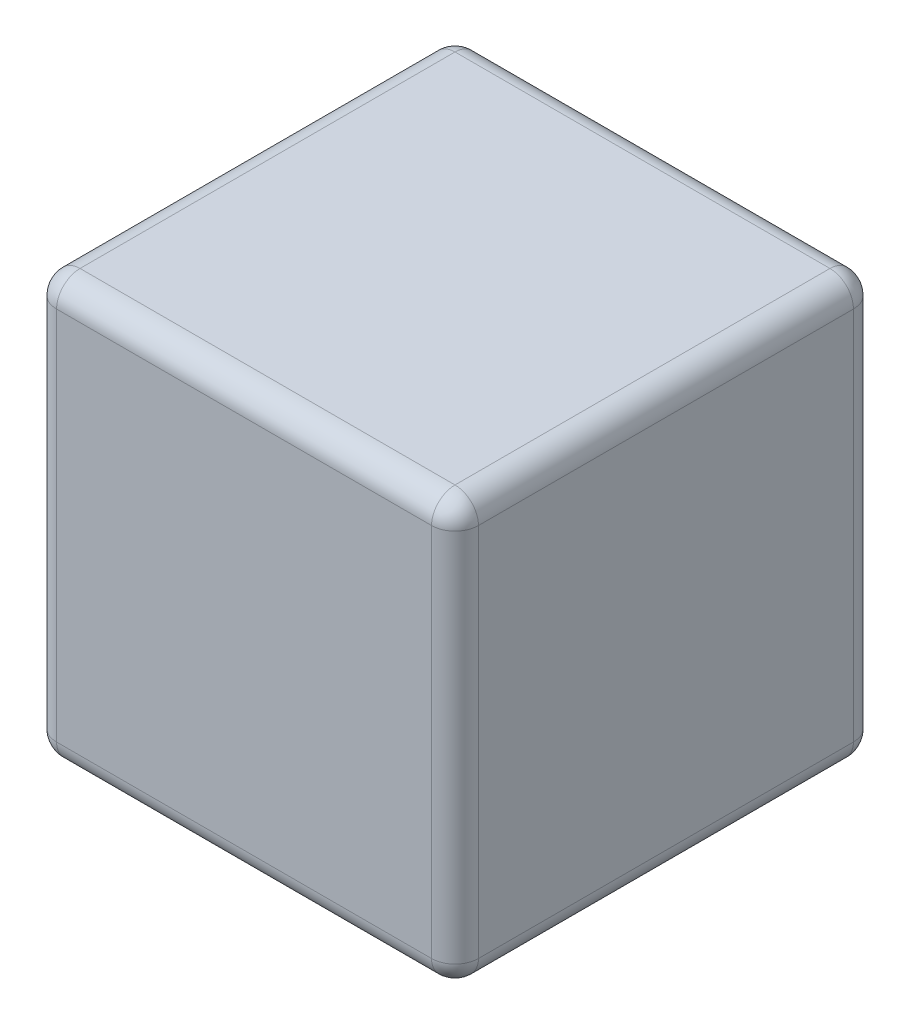
ISO-10303-21;
HEADER;
FILE_DESCRIPTION(('STEP AP214'),'2;1');
FILE_NAME('part.step','',(''),(''),'','','');
FILE_SCHEMA(('AUTOMOTIVE_DESIGN { 1 0 10303 214 1 1 1 1 }'));
ENDSEC;
DATA;
#1=APPLICATION_CONTEXT('core data for automotive mechanical design processes');
#2=APPLICATION_PROTOCOL_DEFINITION('international standard','automotive_design',2000,#1);
#3=PRODUCT_CONTEXT('',#1,'mechanical');
#4=PRODUCT('Part','Part','',(#3));
#5=PRODUCT_RELATED_PRODUCT_CATEGORY('part','',(#4));
#6=PRODUCT_DEFINITION_FORMATION('','',#4);
#7=PRODUCT_DEFINITION_CONTEXT('part definition',#1,'design');
#8=PRODUCT_DEFINITION('design','',#6,#7);
#9=PRODUCT_DEFINITION_SHAPE('','',#8);
#10=(LENGTH_UNIT() NAMED_UNIT(*) SI_UNIT(.MILLI.,.METRE.));
#11=(NAMED_UNIT(*) PLANE_ANGLE_UNIT() SI_UNIT($,.RADIAN.));
#12=(NAMED_UNIT(*) SI_UNIT($,.STERADIAN.) SOLID_ANGLE_UNIT());
#13=UNCERTAINTY_MEASURE_WITH_UNIT(LENGTH_MEASURE(1.E-05),#10,'distance_accuracy_value','');
#14=(GEOMETRIC_REPRESENTATION_CONTEXT(3) GLOBAL_UNCERTAINTY_ASSIGNED_CONTEXT((#13)) GLOBAL_UNIT_ASSIGNED_CONTEXT((#10,
#11,#12)) REPRESENTATION_CONTEXT('',''));
#15=CARTESIAN_POINT('',(0.,0.,0.));
#16=DIRECTION('',(0.,0.,1.));
#17=DIRECTION('',(1.,0.,0.));
#18=AXIS2_PLACEMENT_3D('',#15,#16,#17);
#19=CARTESIAN_POINT('',(0.,18.,0.));
#20=DIRECTION('',(1.,0.,0.));
#21=DIRECTION('',(0.,0.,-1.));
#22=AXIS2_PLACEMENT_3D('',#19,#20,#21);
#23=PLANE('',#22);
#24=DIRECTION('',(0.,0.,1.));
#25=VECTOR('',#24,1.);
#26=CARTESIAN_POINT('',(0.,17.,0.));
#27=LINE('',#26,#25);
#28=CARTESIAN_POINT('',(0.,17.,-1.));
#29=VERTEX_POINT('',#28);
#30=CARTESIAN_POINT('',(0.,17.,-17.));
#31=VERTEX_POINT('',#30);
#32=EDGE_CURVE('E193',#29,#31,#27,.F.);
#33=ORIENTED_EDGE('',*,*,#32,.T.);
#34=DIRECTION('',(0.,-1.,0.));
#35=VECTOR('',#34,1.);
#36=CARTESIAN_POINT('',(0.,18.,-17.));
#37=LINE('',#36,#35);
#38=CARTESIAN_POINT('',(0.,1.,-17.));
#39=VERTEX_POINT('',#38);
#40=EDGE_CURVE('E195',#31,#39,#37,.T.);
#41=ORIENTED_EDGE('',*,*,#40,.T.);
#42=DIRECTION('',(0.,0.,1.));
#43=VECTOR('',#42,1.);
#44=CARTESIAN_POINT('',(0.,1.,0.));
#45=LINE('',#44,#43);
#46=CARTESIAN_POINT('',(0.,1.,-1.));
#47=VERTEX_POINT('',#46);
#48=EDGE_CURVE('E191',#39,#47,#45,.T.);
#49=ORIENTED_EDGE('',*,*,#48,.T.);
#50=DIRECTION('',(0.,-1.,0.));
#51=VECTOR('',#50,1.);
#52=CARTESIAN_POINT('',(0.,18.,-1.));
#53=LINE('',#52,#51);
#54=EDGE_CURVE('E189',#47,#29,#53,.F.);
#55=ORIENTED_EDGE('',*,*,#54,.T.);
#56=EDGE_LOOP('',(#33,#41,#49,#55));
#57=FACE_BOUND('',#56,.T.);
#58=ADVANCED_FACE('F37',(#57),#23,.F.);
#59=CARTESIAN_POINT('',(0.,18.,0.));
#60=DIRECTION('',(0.,0.,-1.));
#61=DIRECTION('',(-1.,0.,0.));
#62=AXIS2_PLACEMENT_3D('',#59,#60,#61);
#63=PLANE('',#62);
#64=DIRECTION('',(1.,0.,0.));
#65=VECTOR('',#64,1.);
#66=CARTESIAN_POINT('',(0.,17.,0.));
#67=LINE('',#66,#65);
#68=CARTESIAN_POINT('',(17.,17.,0.));
#69=VERTEX_POINT('',#68);
#70=CARTESIAN_POINT('',(1.,17.,0.));
#71=VERTEX_POINT('',#70);
#72=EDGE_CURVE('E46',#69,#71,#67,.F.);
#73=ORIENTED_EDGE('',*,*,#72,.T.);
#74=DIRECTION('',(0.,-1.,0.));
#75=VECTOR('',#74,1.);
#76=CARTESIAN_POINT('',(1.,18.,0.));
#77=LINE('',#76,#75);
#78=CARTESIAN_POINT('',(1.,1.,0.));
#79=VERTEX_POINT('',#78);
#80=EDGE_CURVE('E11',#71,#79,#77,.T.);
#81=ORIENTED_EDGE('',*,*,#80,.T.);
#82=DIRECTION('',(1.,0.,0.));
#83=VECTOR('',#82,1.);
#84=CARTESIAN_POINT('',(18.,1.,0.));
#85=LINE('',#84,#83);
#86=CARTESIAN_POINT('',(17.,1.,0.));
#87=VERTEX_POINT('',#86);
#88=EDGE_CURVE('E198',#79,#87,#85,.T.);
#89=ORIENTED_EDGE('',*,*,#88,.T.);
#90=DIRECTION('',(0.,-1.,0.));
#91=VECTOR('',#90,1.);
#92=CARTESIAN_POINT('',(17.,18.,0.));
#93=LINE('',#92,#91);
#94=EDGE_CURVE('E57',#87,#69,#93,.F.);
#95=ORIENTED_EDGE('',*,*,#94,.T.);
#96=EDGE_LOOP('',(#73,#81,#89,#95));
#97=FACE_BOUND('',#96,.T.);
#98=ADVANCED_FACE('F300',(#97),#63,.F.);
#99=CARTESIAN_POINT('',(18.,18.,0.));
#100=DIRECTION('',(-1.,0.,0.));
#101=DIRECTION('',(0.,0.,1.));
#102=AXIS2_PLACEMENT_3D('',#99,#100,#101);
#103=PLANE('',#102);
#104=DIRECTION('',(0.,0.,-1.));
#105=VECTOR('',#104,1.);
#106=CARTESIAN_POINT('',(18.,1.,-18.));
#107=LINE('',#106,#105);
#108=CARTESIAN_POINT('',(18.,1.,-1.));
#109=VERTEX_POINT('',#108);
#110=CARTESIAN_POINT('',(18.,1.,-17.));
#111=VERTEX_POINT('',#110);
#112=EDGE_CURVE('E175',#109,#111,#107,.T.);
#113=ORIENTED_EDGE('',*,*,#112,.T.);
#114=DIRECTION('',(0.,-1.,0.));
#115=VECTOR('',#114,1.);
#116=CARTESIAN_POINT('',(18.,18.,-17.));
#117=LINE('',#116,#115);
#118=CARTESIAN_POINT('',(18.,17.,-17.));
#119=VERTEX_POINT('',#118);
#120=EDGE_CURVE('E177',#111,#119,#117,.F.);
#121=ORIENTED_EDGE('',*,*,#120,.T.);
#122=DIRECTION('',(0.,0.,-1.));
#123=VECTOR('',#122,1.);
#124=CARTESIAN_POINT('',(18.,17.,0.));
#125=LINE('',#124,#123);
#126=CARTESIAN_POINT('',(18.,17.,-1.));
#127=VERTEX_POINT('',#126);
#128=EDGE_CURVE('E173',#119,#127,#125,.F.);
#129=ORIENTED_EDGE('',*,*,#128,.T.);
#130=DIRECTION('',(0.,-1.,0.));
#131=VECTOR('',#130,1.);
#132=CARTESIAN_POINT('',(18.,18.,-1.));
#133=LINE('',#132,#131);
#134=EDGE_CURVE('E171',#127,#109,#133,.T.);
#135=ORIENTED_EDGE('',*,*,#134,.T.);
#136=EDGE_LOOP('',(#113,#121,#129,#135));
#137=FACE_BOUND('',#136,.T.);
#138=ADVANCED_FACE('F272',(#137),#103,.F.);
#139=CARTESIAN_POINT('',(0.,18.,-18.));
#140=DIRECTION('',(0.,0.,1.));
#141=DIRECTION('',(1.,0.,0.));
#142=AXIS2_PLACEMENT_3D('',#139,#140,#141);
#143=PLANE('',#142);
#144=DIRECTION('',(0.,-1.,0.));
#145=VECTOR('',#144,1.);
#146=CARTESIAN_POINT('',(17.,18.,-18.));
#147=LINE('',#146,#145);
#148=CARTESIAN_POINT('',(17.,17.,-18.));
#149=VERTEX_POINT('',#148);
#150=CARTESIAN_POINT('',(17.,1.,-18.));
#151=VERTEX_POINT('',#150);
#152=EDGE_CURVE('E158',#149,#151,#147,.T.);
#153=ORIENTED_EDGE('',*,*,#152,.T.);
#154=DIRECTION('',(-1.,0.,0.));
#155=VECTOR('',#154,1.);
#156=CARTESIAN_POINT('',(0.,1.,-18.));
#157=LINE('',#156,#155);
#158=CARTESIAN_POINT('',(0.999999999999997,1.,-18.));
#159=VERTEX_POINT('',#158);
#160=EDGE_CURVE('E130',#151,#159,#157,.T.);
#161=ORIENTED_EDGE('',*,*,#160,.T.);
#162=DIRECTION('',(0.,-1.,0.));
#163=VECTOR('',#162,1.);
#164=CARTESIAN_POINT('',(0.999999999999997,18.,-18.));
#165=LINE('',#164,#163);
#166=CARTESIAN_POINT('',(0.999999999999997,17.,-18.));
#167=VERTEX_POINT('',#166);
#168=EDGE_CURVE('E148',#159,#167,#165,.F.);
#169=ORIENTED_EDGE('',*,*,#168,.T.);
#170=DIRECTION('',(-1.,0.,0.));
#171=VECTOR('',#170,1.);
#172=CARTESIAN_POINT('',(0.,17.,-18.));
#173=LINE('',#172,#171);
#174=EDGE_CURVE('E154',#167,#149,#173,.F.);
#175=ORIENTED_EDGE('',*,*,#174,.T.);
#176=EDGE_LOOP('',(#153,#161,#169,#175));
#177=FACE_BOUND('',#176,.T.);
#178=ADVANCED_FACE('F156',(#177),#143,.F.);
#179=CARTESIAN_POINT('',(0.,18.,0.));
#180=DIRECTION('',(0.,-1.,0.));
#181=DIRECTION('',(0.,0.,-1.));
#182=AXIS2_PLACEMENT_3D('',#179,#180,#181);
#183=PLANE('',#182);
#184=DIRECTION('',(0.,0.,-1.));
#185=VECTOR('',#184,1.);
#186=CARTESIAN_POINT('',(17.,18.,0.));
#187=LINE('',#186,#185);
#188=CARTESIAN_POINT('',(17.,18.,-1.));
#189=VERTEX_POINT('',#188);
#190=CARTESIAN_POINT('',(17.,18.,-17.));
#191=VERTEX_POINT('',#190);
#192=EDGE_CURVE('E184',#189,#191,#187,.T.);
#193=ORIENTED_EDGE('',*,*,#192,.T.);
#194=DIRECTION('',(-1.,0.,0.));
#195=VECTOR('',#194,1.);
#196=CARTESIAN_POINT('',(0.,18.,-17.));
#197=LINE('',#196,#195);
#198=CARTESIAN_POINT('',(0.999999999999997,18.,-17.));
#199=VERTEX_POINT('',#198);
#200=EDGE_CURVE('E186',#191,#199,#197,.T.);
#201=ORIENTED_EDGE('',*,*,#200,.T.);
#202=DIRECTION('',(0.,0.,1.));
#203=VECTOR('',#202,1.);
#204=CARTESIAN_POINT('',(1.,18.,0.));
#205=LINE('',#204,#203);
#206=CARTESIAN_POINT('',(1.,18.,-1.));
#207=VERTEX_POINT('',#206);
#208=EDGE_CURVE('E182',#199,#207,#205,.T.);
#209=ORIENTED_EDGE('',*,*,#208,.T.);
#210=DIRECTION('',(1.,0.,0.));
#211=VECTOR('',#210,1.);
#212=CARTESIAN_POINT('',(0.,18.,-1.));
#213=LINE('',#212,#211);
#214=EDGE_CURVE('E180',#207,#189,#213,.T.);
#215=ORIENTED_EDGE('',*,*,#214,.T.);
#216=EDGE_LOOP('',(#193,#201,#209,#215));
#217=FACE_BOUND('',#216,.T.);
#218=ADVANCED_FACE('F281',(#217),#183,.F.);
#219=CARTESIAN_POINT('',(0.,0.,0.));
#220=DIRECTION('',(0.,-1.,0.));
#221=DIRECTION('',(0.,0.,-1.));
#222=AXIS2_PLACEMENT_3D('',#219,#220,#221);
#223=PLANE('',#222);
#224=DIRECTION('',(0.,0.,1.));
#225=VECTOR('',#224,1.);
#226=CARTESIAN_POINT('',(0.999999999999997,0.,-18.));
#227=LINE('',#226,#225);
#228=CARTESIAN_POINT('',(1.,0.,-1.));
#229=VERTEX_POINT('',#228);
#230=CARTESIAN_POINT('',(0.999999999999997,0.,-17.));
#231=VERTEX_POINT('',#230);
#232=EDGE_CURVE('E162',#229,#231,#227,.F.);
#233=ORIENTED_EDGE('',*,*,#232,.T.);
#234=DIRECTION('',(-1.,0.,0.));
#235=VECTOR('',#234,1.);
#236=CARTESIAN_POINT('',(18.,0.,-17.));
#237=LINE('',#236,#235);
#238=CARTESIAN_POINT('',(17.,0.,-17.));
#239=VERTEX_POINT('',#238);
#240=EDGE_CURVE('E132',#231,#239,#237,.F.);
#241=ORIENTED_EDGE('',*,*,#240,.T.);
#242=DIRECTION('',(0.,0.,-1.));
#243=VECTOR('',#242,1.);
#244=CARTESIAN_POINT('',(17.,0.,0.));
#245=LINE('',#244,#243);
#246=CARTESIAN_POINT('',(17.,0.,-1.));
#247=VERTEX_POINT('',#246);
#248=EDGE_CURVE('E168',#239,#247,#245,.F.);
#249=ORIENTED_EDGE('',*,*,#248,.T.);
#250=DIRECTION('',(1.,0.,0.));
#251=VECTOR('',#250,1.);
#252=CARTESIAN_POINT('',(0.,0.,-1.));
#253=LINE('',#252,#251);
#254=EDGE_CURVE('E160',#247,#229,#253,.F.);
#255=ORIENTED_EDGE('',*,*,#254,.T.);
#256=EDGE_LOOP('',(#233,#241,#249,#255));
#257=FACE_BOUND('',#256,.T.);
#258=ADVANCED_FACE('F360',(#257),#223,.T.);
#259=CARTESIAN_POINT('',(0.,17.,-1.));
#260=DIRECTION('',(1.,0.,0.));
#261=DIRECTION('',(0.,0.,-1.));
#262=AXIS2_PLACEMENT_3D('',#259,#260,#261);
#263=CYLINDRICAL_SURFACE('',#262,1.);
#264=CARTESIAN_POINT('',(17.,17.,-1.));
#265=DIRECTION('',(1.,0.,0.));
#266=DIRECTION('',(0.,0.,-1.));
#267=AXIS2_PLACEMENT_3D('',#264,#265,#266);
#268=CIRCLE('',#267,1.);
#269=EDGE_CURVE('E41',#189,#69,#268,.T.);
#270=ORIENTED_EDGE('',*,*,#269,.F.);
#271=ORIENTED_EDGE('',*,*,#214,.F.);
#272=CARTESIAN_POINT('',(1.,17.,-1.));
#273=DIRECTION('',(-1.,0.,0.));
#274=DIRECTION('',(0.,0.,1.));
#275=AXIS2_PLACEMENT_3D('',#272,#273,#274);
#276=CIRCLE('',#275,1.);
#277=EDGE_CURVE('E251',#71,#207,#276,.T.);
#278=ORIENTED_EDGE('',*,*,#277,.F.);
#279=ORIENTED_EDGE('',*,*,#72,.F.);
#280=EDGE_LOOP('',(#270,#271,#278,#279));
#281=FACE_BOUND('',#280,.T.);
#282=ADVANCED_FACE('F39',(#281),#263,.T.);
#283=CARTESIAN_POINT('',(17.,17.,-1.));
#284=DIRECTION('',(0.,0.,1.));
#285=DIRECTION('',(1.,0.,0.));
#286=AXIS2_PLACEMENT_3D('',#283,#284,#285);
#287=SPHERICAL_SURFACE('',#286,1.);
#288=CARTESIAN_POINT('',(17.,17.,-1.));
#289=DIRECTION('',(0.,0.,1.));
#290=DIRECTION('',(1.,0.,0.));
#291=AXIS2_PLACEMENT_3D('',#288,#289,#290);
#292=CIRCLE('',#291,1.);
#293=EDGE_CURVE('E246',#189,#127,#292,.F.);
#294=ORIENTED_EDGE('',*,*,#293,.F.);
#295=ORIENTED_EDGE('',*,*,#269,.T.);
#296=CARTESIAN_POINT('',(17.,17.,-1.));
#297=DIRECTION('',(0.,1.,0.));
#298=DIRECTION('',(0.,0.,1.));
#299=AXIS2_PLACEMENT_3D('',#296,#297,#298);
#300=CIRCLE('',#299,1.);
#301=EDGE_CURVE('E249',#127,#69,#300,.F.);
#302=ORIENTED_EDGE('',*,*,#301,.F.);
#303=EDGE_LOOP('',(#294,#295,#302));
#304=FACE_BOUND('',#303,.T.);
#305=ADVANCED_FACE('F261',(#304),#287,.T.);
#306=CARTESIAN_POINT('',(1.,17.,-1.));
#307=DIRECTION('',(0.,1.,0.));
#308=DIRECTION('',(0.,0.,1.));
#309=AXIS2_PLACEMENT_3D('',#306,#307,#308);
#310=SPHERICAL_SURFACE('',#309,1.);
#311=CARTESIAN_POINT('',(1.,17.,-1.));
#312=DIRECTION('',(0.,1.,0.));
#313=DIRECTION('',(0.,0.,1.));
#314=AXIS2_PLACEMENT_3D('',#311,#312,#313);
#315=CIRCLE('',#314,1.);
#316=EDGE_CURVE('E240',#71,#29,#315,.F.);
#317=ORIENTED_EDGE('',*,*,#316,.F.);
#318=ORIENTED_EDGE('',*,*,#277,.T.);
#319=CARTESIAN_POINT('',(1.,17.,-1.));
#320=DIRECTION('',(0.,0.,1.));
#321=DIRECTION('',(1.,0.,0.));
#322=AXIS2_PLACEMENT_3D('',#319,#320,#321);
#323=CIRCLE('',#322,1.);
#324=EDGE_CURVE('E243',#29,#207,#323,.F.);
#325=ORIENTED_EDGE('',*,*,#324,.F.);
#326=EDGE_LOOP('',(#317,#318,#325));
#327=FACE_BOUND('',#326,.T.);
#328=ADVANCED_FACE('F294',(#327),#310,.T.);
#329=CARTESIAN_POINT('',(17.,18.,-1.));
#330=DIRECTION('',(0.,-1.,0.));
#331=DIRECTION('',(0.,0.,-1.));
#332=AXIS2_PLACEMENT_3D('',#329,#330,#331);
#333=CYLINDRICAL_SURFACE('',#332,1.);
#334=ORIENTED_EDGE('',*,*,#301,.T.);
#335=ORIENTED_EDGE('',*,*,#94,.F.);
#336=CARTESIAN_POINT('',(17.,1.,-1.));
#337=DIRECTION('',(0.,-1.,0.));
#338=DIRECTION('',(0.,0.,-1.));
#339=AXIS2_PLACEMENT_3D('',#336,#337,#338);
#340=CIRCLE('',#339,1.);
#341=EDGE_CURVE('E234',#109,#87,#340,.T.);
#342=ORIENTED_EDGE('',*,*,#341,.F.);
#343=ORIENTED_EDGE('',*,*,#134,.F.);
#344=EDGE_LOOP('',(#334,#335,#342,#343));
#345=FACE_BOUND('',#344,.T.);
#346=ADVANCED_FACE('F267',(#345),#333,.T.);
#347=CARTESIAN_POINT('',(17.,17.,0.));
#348=DIRECTION('',(0.,0.,-1.));
#349=DIRECTION('',(-1.,0.,0.));
#350=AXIS2_PLACEMENT_3D('',#347,#348,#349);
#351=CYLINDRICAL_SURFACE('',#350,1.);
#352=ORIENTED_EDGE('',*,*,#293,.T.);
#353=ORIENTED_EDGE('',*,*,#128,.F.);
#354=CARTESIAN_POINT('',(17.,17.,-17.));
#355=DIRECTION('',(0.,0.,-1.));
#356=DIRECTION('',(-1.,0.,0.));
#357=AXIS2_PLACEMENT_3D('',#354,#355,#356);
#358=CIRCLE('',#357,1.);
#359=EDGE_CURVE('E231',#191,#119,#358,.T.);
#360=ORIENTED_EDGE('',*,*,#359,.F.);
#361=ORIENTED_EDGE('',*,*,#192,.F.);
#362=EDGE_LOOP('',(#352,#353,#360,#361));
#363=FACE_BOUND('',#362,.T.);
#364=ADVANCED_FACE('F278',(#363),#351,.T.);
#365=CARTESIAN_POINT('',(0.,17.,-17.));
#366=DIRECTION('',(-1.,0.,0.));
#367=DIRECTION('',(0.,0.,1.));
#368=AXIS2_PLACEMENT_3D('',#365,#366,#367);
#369=CYLINDRICAL_SURFACE('',#368,1.);
#370=CARTESIAN_POINT('',(0.999999999999997,17.,-17.));
#371=DIRECTION('',(-1.,0.,0.));
#372=DIRECTION('',(0.,0.,1.));
#373=AXIS2_PLACEMENT_3D('',#370,#371,#372);
#374=CIRCLE('',#373,1.);
#375=EDGE_CURVE('E225',#199,#167,#374,.T.);
#376=ORIENTED_EDGE('',*,*,#375,.F.);
#377=ORIENTED_EDGE('',*,*,#200,.F.);
#378=CARTESIAN_POINT('',(17.,17.,-17.));
#379=DIRECTION('',(1.,0.,0.));
#380=DIRECTION('',(0.,0.,-1.));
#381=AXIS2_PLACEMENT_3D('',#378,#379,#380);
#382=CIRCLE('',#381,1.);
#383=EDGE_CURVE('E228',#149,#191,#382,.T.);
#384=ORIENTED_EDGE('',*,*,#383,.F.);
#385=ORIENTED_EDGE('',*,*,#174,.F.);
#386=EDGE_LOOP('',(#376,#377,#384,#385));
#387=FACE_BOUND('',#386,.T.);
#388=ADVANCED_FACE('F285',(#387),#369,.T.);
#389=CARTESIAN_POINT('',(1.,17.,0.));
#390=DIRECTION('',(0.,0.,1.));
#391=DIRECTION('',(1.,0.,0.));
#392=AXIS2_PLACEMENT_3D('',#389,#390,#391);
#393=CYLINDRICAL_SURFACE('',#392,1.);
#394=ORIENTED_EDGE('',*,*,#324,.T.);
#395=ORIENTED_EDGE('',*,*,#208,.F.);
#396=CARTESIAN_POINT('',(0.999999999999997,17.,-17.));
#397=DIRECTION('',(0.,0.,-1.));
#398=DIRECTION('',(-1.,0.,0.));
#399=AXIS2_PLACEMENT_3D('',#396,#397,#398);
#400=CIRCLE('',#399,1.);
#401=EDGE_CURVE('E223',#31,#199,#400,.T.);
#402=ORIENTED_EDGE('',*,*,#401,.F.);
#403=ORIENTED_EDGE('',*,*,#32,.F.);
#404=EDGE_LOOP('',(#394,#395,#402,#403));
#405=FACE_BOUND('',#404,.T.);
#406=ADVANCED_FACE('F291',(#405),#393,.T.);
#407=CARTESIAN_POINT('',(1.,18.,-1.));
#408=DIRECTION('',(0.,-1.,0.));
#409=DIRECTION('',(0.,0.,-1.));
#410=AXIS2_PLACEMENT_3D('',#407,#408,#409);
#411=CYLINDRICAL_SURFACE('',#410,1.);
#412=ORIENTED_EDGE('',*,*,#316,.T.);
#413=ORIENTED_EDGE('',*,*,#54,.F.);
#414=CARTESIAN_POINT('',(1.,1.,-1.));
#415=DIRECTION('',(0.,-1.,0.));
#416=DIRECTION('',(0.,0.,-1.));
#417=AXIS2_PLACEMENT_3D('',#414,#415,#416);
#418=CIRCLE('',#417,1.);
#419=EDGE_CURVE('E220',#79,#47,#418,.T.);
#420=ORIENTED_EDGE('',*,*,#419,.F.);
#421=ORIENTED_EDGE('',*,*,#80,.F.);
#422=EDGE_LOOP('',(#412,#413,#420,#421));
#423=FACE_BOUND('',#422,.T.);
#424=ADVANCED_FACE('F298',(#423),#411,.T.);
#425=CARTESIAN_POINT('',(0.,1.,-1.));
#426=DIRECTION('',(-1.,0.,0.));
#427=DIRECTION('',(0.,0.,1.));
#428=AXIS2_PLACEMENT_3D('',#425,#426,#427);
#429=CYLINDRICAL_SURFACE('',#428,1.);
#430=CARTESIAN_POINT('',(17.,1.,-1.));
#431=DIRECTION('',(1.,0.,0.));
#432=DIRECTION('',(0.,0.,-1.));
#433=AXIS2_PLACEMENT_3D('',#430,#431,#432);
#434=CIRCLE('',#433,1.);
#435=EDGE_CURVE('E237',#87,#247,#434,.T.);
#436=ORIENTED_EDGE('',*,*,#435,.F.);
#437=ORIENTED_EDGE('',*,*,#88,.F.);
#438=CARTESIAN_POINT('',(1.,1.,-1.));
#439=DIRECTION('',(-1.,0.,0.));
#440=DIRECTION('',(0.,0.,1.));
#441=AXIS2_PLACEMENT_3D('',#438,#439,#440);
#442=CIRCLE('',#441,1.);
#443=EDGE_CURVE('E218',#229,#79,#442,.T.);
#444=ORIENTED_EDGE('',*,*,#443,.F.);
#445=ORIENTED_EDGE('',*,*,#254,.F.);
#446=EDGE_LOOP('',(#436,#437,#444,#445));
#447=FACE_BOUND('',#446,.T.);
#448=ADVANCED_FACE('F303',(#447),#429,.T.);
#449=CARTESIAN_POINT('',(17.,1.,-1.));
#450=DIRECTION('',(0.,0.,1.));
#451=DIRECTION('',(0.,-1.,0.));
#452=AXIS2_PLACEMENT_3D('',#449,#450,#451);
#453=SPHERICAL_SURFACE('',#452,1.);
#454=ORIENTED_EDGE('',*,*,#341,.T.);
#455=ORIENTED_EDGE('',*,*,#435,.T.);
#456=CARTESIAN_POINT('',(17.,1.,-1.));
#457=DIRECTION('',(0.,0.,1.));
#458=DIRECTION('',(1.,0.,0.));
#459=AXIS2_PLACEMENT_3D('',#456,#457,#458);
#460=CIRCLE('',#459,1.);
#461=EDGE_CURVE('E215',#109,#247,#460,.F.);
#462=ORIENTED_EDGE('',*,*,#461,.F.);
#463=EDGE_LOOP('',(#454,#455,#462));
#464=FACE_BOUND('',#463,.T.);
#465=ADVANCED_FACE('F307',(#464),#453,.T.);
#466=CARTESIAN_POINT('',(17.,17.,-17.));
#467=DIRECTION('',(0.,1.,0.));
#468=DIRECTION('',(0.,0.,1.));
#469=AXIS2_PLACEMENT_3D('',#466,#467,#468);
#470=SPHERICAL_SURFACE('',#469,1.);
#471=ORIENTED_EDGE('',*,*,#383,.T.);
#472=ORIENTED_EDGE('',*,*,#359,.T.);
#473=CARTESIAN_POINT('',(17.,17.,-17.));
#474=DIRECTION('',(0.,1.,0.));
#475=DIRECTION('',(0.,0.,1.));
#476=AXIS2_PLACEMENT_3D('',#473,#474,#475);
#477=CIRCLE('',#476,1.);
#478=EDGE_CURVE('E213',#149,#119,#477,.F.);
#479=ORIENTED_EDGE('',*,*,#478,.F.);
#480=EDGE_LOOP('',(#471,#472,#479));
#481=FACE_BOUND('',#480,.T.);
#482=ADVANCED_FACE('F318',(#481),#470,.T.);
#483=CARTESIAN_POINT('',(0.999999999999997,17.,-17.));
#484=DIRECTION('',(0.,1.,0.));
#485=DIRECTION('',(0.,0.,1.));
#486=AXIS2_PLACEMENT_3D('',#483,#484,#485);
#487=SPHERICAL_SURFACE('',#486,1.);
#488=ORIENTED_EDGE('',*,*,#401,.T.);
#489=ORIENTED_EDGE('',*,*,#375,.T.);
#490=CARTESIAN_POINT('',(0.999999999999997,17.,-17.));
#491=DIRECTION('',(0.,1.,0.));
#492=DIRECTION('',(0.,0.,1.));
#493=AXIS2_PLACEMENT_3D('',#490,#491,#492);
#494=CIRCLE('',#493,1.);
#495=EDGE_CURVE('E151',#31,#167,#494,.F.);
#496=ORIENTED_EDGE('',*,*,#495,.F.);
#497=EDGE_LOOP('',(#488,#489,#496));
#498=FACE_BOUND('',#497,.T.);
#499=ADVANCED_FACE('F320',(#498),#487,.T.);
#500=CARTESIAN_POINT('',(1.,1.,-1.));
#501=DIRECTION('',(0.,0.,1.));
#502=DIRECTION('',(0.,-1.,0.));
#503=AXIS2_PLACEMENT_3D('',#500,#501,#502);
#504=SPHERICAL_SURFACE('',#503,1.);
#505=ORIENTED_EDGE('',*,*,#443,.T.);
#506=ORIENTED_EDGE('',*,*,#419,.T.);
#507=CARTESIAN_POINT('',(1.,1.,-1.));
#508=DIRECTION('',(0.,0.,1.));
#509=DIRECTION('',(1.,0.,0.));
#510=AXIS2_PLACEMENT_3D('',#507,#508,#509);
#511=CIRCLE('',#510,1.);
#512=EDGE_CURVE('E209',#229,#47,#511,.F.);
#513=ORIENTED_EDGE('',*,*,#512,.F.);
#514=EDGE_LOOP('',(#505,#506,#513));
#515=FACE_BOUND('',#514,.T.);
#516=ADVANCED_FACE('F326',(#515),#504,.T.);
#517=CARTESIAN_POINT('',(17.,1.,0.));
#518=DIRECTION('',(0.,0.,1.));
#519=DIRECTION('',(1.,0.,0.));
#520=AXIS2_PLACEMENT_3D('',#517,#518,#519);
#521=CYLINDRICAL_SURFACE('',#520,1.);
#522=ORIENTED_EDGE('',*,*,#461,.T.);
#523=ORIENTED_EDGE('',*,*,#248,.F.);
#524=CARTESIAN_POINT('',(17.,1.,-17.));
#525=DIRECTION('',(0.,0.,-1.));
#526=DIRECTION('',(-1.,0.,0.));
#527=AXIS2_PLACEMENT_3D('',#524,#525,#526);
#528=CIRCLE('',#527,1.);
#529=EDGE_CURVE('E206',#111,#239,#528,.T.);
#530=ORIENTED_EDGE('',*,*,#529,.F.);
#531=ORIENTED_EDGE('',*,*,#112,.F.);
#532=EDGE_LOOP('',(#522,#523,#530,#531));
#533=FACE_BOUND('',#532,.T.);
#534=ADVANCED_FACE('F311',(#533),#521,.T.);
#535=CARTESIAN_POINT('',(17.,18.,-17.));
#536=DIRECTION('',(0.,-1.,0.));
#537=DIRECTION('',(0.,0.,-1.));
#538=AXIS2_PLACEMENT_3D('',#535,#536,#537);
#539=CYLINDRICAL_SURFACE('',#538,1.);
#540=ORIENTED_EDGE('',*,*,#478,.T.);
#541=ORIENTED_EDGE('',*,*,#120,.F.);
#542=CARTESIAN_POINT('',(17.,1.,-17.));
#543=DIRECTION('',(0.,-1.,0.));
#544=DIRECTION('',(0.,0.,-1.));
#545=AXIS2_PLACEMENT_3D('',#542,#543,#544);
#546=CIRCLE('',#545,1.);
#547=EDGE_CURVE('E145',#151,#111,#546,.T.);
#548=ORIENTED_EDGE('',*,*,#547,.F.);
#549=ORIENTED_EDGE('',*,*,#152,.F.);
#550=EDGE_LOOP('',(#540,#541,#548,#549));
#551=FACE_BOUND('',#550,.T.);
#552=ADVANCED_FACE('F316',(#551),#539,.T.);
#553=CARTESIAN_POINT('',(0.999999999999997,18.,-17.));
#554=DIRECTION('',(0.,-1.,0.));
#555=DIRECTION('',(0.,0.,-1.));
#556=AXIS2_PLACEMENT_3D('',#553,#554,#555);
#557=CYLINDRICAL_SURFACE('',#556,1.);
#558=ORIENTED_EDGE('',*,*,#495,.T.);
#559=ORIENTED_EDGE('',*,*,#168,.F.);
#560=CARTESIAN_POINT('',(0.999999999999997,1.,-17.));
#561=DIRECTION('',(0.,-1.,0.));
#562=DIRECTION('',(0.,0.,-1.));
#563=AXIS2_PLACEMENT_3D('',#560,#561,#562);
#564=CIRCLE('',#563,1.);
#565=EDGE_CURVE('E137',#39,#159,#564,.T.);
#566=ORIENTED_EDGE('',*,*,#565,.F.);
#567=ORIENTED_EDGE('',*,*,#40,.F.);
#568=EDGE_LOOP('',(#558,#559,#566,#567));
#569=FACE_BOUND('',#568,.T.);
#570=ADVANCED_FACE('F149',(#569),#557,.T.);
#571=CARTESIAN_POINT('',(1.,1.,0.));
#572=DIRECTION('',(0.,0.,-1.));
#573=DIRECTION('',(-1.,0.,0.));
#574=AXIS2_PLACEMENT_3D('',#571,#572,#573);
#575=CYLINDRICAL_SURFACE('',#574,1.);
#576=ORIENTED_EDGE('',*,*,#512,.T.);
#577=ORIENTED_EDGE('',*,*,#48,.F.);
#578=CARTESIAN_POINT('',(0.999999999999997,1.,-17.));
#579=DIRECTION('',(0.,0.,-1.));
#580=DIRECTION('',(-1.,0.,0.));
#581=AXIS2_PLACEMENT_3D('',#578,#579,#580);
#582=CIRCLE('',#581,1.);
#583=EDGE_CURVE('E141',#231,#39,#582,.T.);
#584=ORIENTED_EDGE('',*,*,#583,.F.);
#585=ORIENTED_EDGE('',*,*,#232,.F.);
#586=EDGE_LOOP('',(#576,#577,#584,#585));
#587=FACE_BOUND('',#586,.T.);
#588=ADVANCED_FACE('F344',(#587),#575,.T.);
#589=CARTESIAN_POINT('',(17.,1.,-17.));
#590=DIRECTION('',(1.,0.,0.));
#591=DIRECTION('',(0.,1.,0.));
#592=AXIS2_PLACEMENT_3D('',#589,#590,#591);
#593=SPHERICAL_SURFACE('',#592,1.);
#594=ORIENTED_EDGE('',*,*,#547,.T.);
#595=ORIENTED_EDGE('',*,*,#529,.T.);
#596=CARTESIAN_POINT('',(17.,1.,-17.));
#597=DIRECTION('',(1.,0.,0.));
#598=DIRECTION('',(0.,0.,-1.));
#599=AXIS2_PLACEMENT_3D('',#596,#597,#598);
#600=CIRCLE('',#599,1.);
#601=EDGE_CURVE('E134',#151,#239,#600,.F.);
#602=ORIENTED_EDGE('',*,*,#601,.F.);
#603=EDGE_LOOP('',(#594,#595,#602));
#604=FACE_BOUND('',#603,.T.);
#605=ADVANCED_FACE('F314',(#604),#593,.T.);
#606=CARTESIAN_POINT('',(0.999999999999997,1.,-17.));
#607=DIRECTION('',(-1.,0.,0.));
#608=DIRECTION('',(0.,-1.,0.));
#609=AXIS2_PLACEMENT_3D('',#606,#607,#608);
#610=SPHERICAL_SURFACE('',#609,1.);
#611=ORIENTED_EDGE('',*,*,#583,.T.);
#612=ORIENTED_EDGE('',*,*,#565,.T.);
#613=CARTESIAN_POINT('',(0.999999999999997,1.,-17.));
#614=DIRECTION('',(-1.,0.,0.));
#615=DIRECTION('',(0.,-1.,0.));
#616=AXIS2_PLACEMENT_3D('',#613,#614,#615);
#617=CIRCLE('',#616,1.);
#618=EDGE_CURVE('E126',#231,#159,#617,.F.);
#619=ORIENTED_EDGE('',*,*,#618,.F.);
#620=EDGE_LOOP('',(#611,#612,#619));
#621=FACE_BOUND('',#620,.T.);
#622=ADVANCED_FACE('F139',(#621),#610,.T.);
#623=CARTESIAN_POINT('',(0.,1.,-17.));
#624=DIRECTION('',(1.,0.,0.));
#625=DIRECTION('',(0.,0.,-1.));
#626=AXIS2_PLACEMENT_3D('',#623,#624,#625);
#627=CYLINDRICAL_SURFACE('',#626,1.);
#628=ORIENTED_EDGE('',*,*,#601,.T.);
#629=ORIENTED_EDGE('',*,*,#240,.F.);
#630=ORIENTED_EDGE('',*,*,#618,.T.);
#631=ORIENTED_EDGE('',*,*,#160,.F.);
#632=EDGE_LOOP('',(#628,#629,#630,#631));
#633=FACE_BOUND('',#632,.T.);
#634=ADVANCED_FACE('F128',(#633),#627,.T.);
#635=CLOSED_SHELL('',(#58,#98,#138,#178,#218,#258,#282,#305,#328,#346,#364,#388,#406,#424,#448,
#465,#482,#499,#516,#534,#552,#570,#588,#605,#622,#634));
#636=MANIFOLD_SOLID_BREP('B2',#635);
#637=ADVANCED_BREP_SHAPE_REPRESENTATION('',(#18,#636),#14);
#638=SHAPE_DEFINITION_REPRESENTATION(#9,#637);
ENDSEC;
END-ISO-10303-21;
